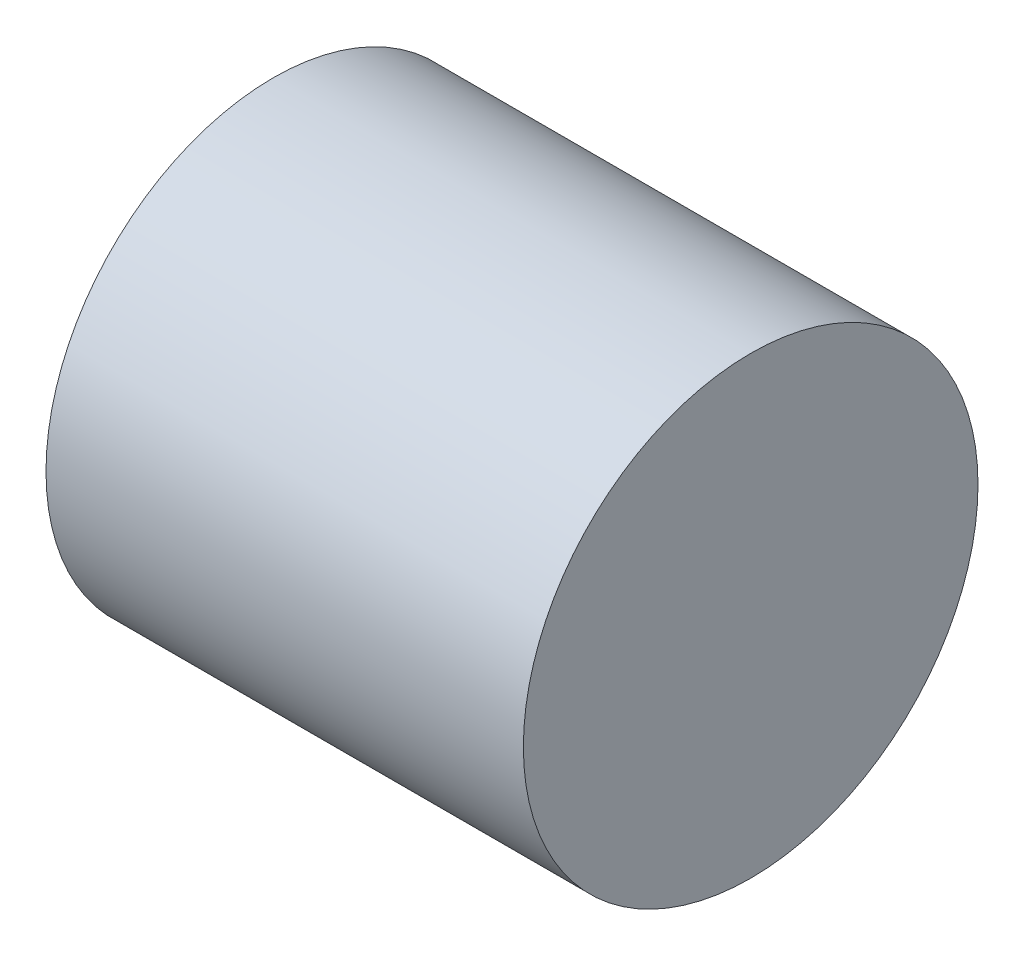
ISO-10303-21;
HEADER;
FILE_DESCRIPTION(('STEP AP214'),'2;1');
FILE_NAME('part.step','',(''),(''),'','','');
FILE_SCHEMA(('AUTOMOTIVE_DESIGN { 1 0 10303 214 1 1 1 1 }'));
ENDSEC;
DATA;
#1=APPLICATION_CONTEXT('core data for automotive mechanical design processes');
#2=APPLICATION_PROTOCOL_DEFINITION('international standard','automotive_design',2000,#1);
#3=PRODUCT_CONTEXT('',#1,'mechanical');
#4=PRODUCT('Part','Part','',(#3));
#5=PRODUCT_RELATED_PRODUCT_CATEGORY('part','',(#4));
#6=PRODUCT_DEFINITION_FORMATION('','',#4);
#7=PRODUCT_DEFINITION_CONTEXT('part definition',#1,'design');
#8=PRODUCT_DEFINITION('design','',#6,#7);
#9=PRODUCT_DEFINITION_SHAPE('','',#8);
#10=(LENGTH_UNIT() NAMED_UNIT(*) SI_UNIT(.MILLI.,.METRE.));
#11=(NAMED_UNIT(*) PLANE_ANGLE_UNIT() SI_UNIT($,.RADIAN.));
#12=(NAMED_UNIT(*) SI_UNIT($,.STERADIAN.) SOLID_ANGLE_UNIT());
#13=UNCERTAINTY_MEASURE_WITH_UNIT(LENGTH_MEASURE(1.E-05),#10,'distance_accuracy_value','');
#14=(GEOMETRIC_REPRESENTATION_CONTEXT(3) GLOBAL_UNCERTAINTY_ASSIGNED_CONTEXT((#13)) GLOBAL_UNIT_ASSIGNED_CONTEXT((#10,
#11,#12)) REPRESENTATION_CONTEXT('',''));
#15=CARTESIAN_POINT('',(0.,0.,0.));
#16=DIRECTION('',(0.,0.,1.));
#17=DIRECTION('',(1.,0.,0.));
#18=AXIS2_PLACEMENT_3D('',#15,#16,#17);
#19=CARTESIAN_POINT('',(16.8,0.,0.));
#20=DIRECTION('',(-1.,0.,0.));
#21=DIRECTION('',(0.,0.,1.));
#22=AXIS2_PLACEMENT_3D('',#19,#20,#21);
#23=CYLINDRICAL_SURFACE('',#22,8.);
#24=CARTESIAN_POINT('',(16.8,0.,0.));
#25=DIRECTION('',(1.,0.,0.));
#26=DIRECTION('',(0.,0.,-1.));
#27=AXIS2_PLACEMENT_3D('',#24,#25,#26);
#28=CIRCLE('',#27,8.);
#29=CARTESIAN_POINT('',(16.8,0.,-8.));
#30=VERTEX_POINT('',#29);
#31=EDGE_CURVE('E10',#30,#30,#28,.T.);
#32=ORIENTED_EDGE('',*,*,#31,.F.);
#33=EDGE_LOOP('',(#32));
#34=FACE_BOUND('',#33,.T.);
#35=CARTESIAN_POINT('',(0.,0.,0.));
#36=DIRECTION('',(1.,0.,0.));
#37=DIRECTION('',(0.,0.,-1.));
#38=AXIS2_PLACEMENT_3D('',#35,#36,#37);
#39=CIRCLE('',#38,8.);
#40=CARTESIAN_POINT('',(0.,0.,-8.));
#41=VERTEX_POINT('',#40);
#42=EDGE_CURVE('E34',#41,#41,#39,.T.);
#43=ORIENTED_EDGE('',*,*,#42,.T.);
#44=EDGE_LOOP('',(#43));
#45=FACE_BOUND('',#44,.T.);
#46=ADVANCED_FACE('F31',(#34,#45),#23,.T.);
#47=CARTESIAN_POINT('',(16.8,0.,0.));
#48=DIRECTION('',(1.,0.,0.));
#49=DIRECTION('',(0.,0.,-1.));
#50=AXIS2_PLACEMENT_3D('',#47,#48,#49);
#51=PLANE('',#50);
#52=ORIENTED_EDGE('',*,*,#31,.T.);
#53=EDGE_LOOP('',(#52));
#54=FACE_BOUND('',#53,.T.);
#55=ADVANCED_FACE('F46',(#54),#51,.T.);
#56=CARTESIAN_POINT('',(0.,0.,0.));
#57=DIRECTION('',(1.,0.,0.));
#58=DIRECTION('',(0.,0.,-1.));
#59=AXIS2_PLACEMENT_3D('',#56,#57,#58);
#60=PLANE('',#59);
#61=ORIENTED_EDGE('',*,*,#42,.F.);
#62=EDGE_LOOP('',(#61));
#63=FACE_BOUND('',#62,.T.);
#64=ADVANCED_FACE('F44',(#63),#60,.F.);
#65=CLOSED_SHELL('',(#46,#55,#64));
#66=MANIFOLD_SOLID_BREP('B2',#65);
#67=ADVANCED_BREP_SHAPE_REPRESENTATION('',(#18,#66),#14);
#68=SHAPE_DEFINITION_REPRESENTATION(#9,#67);
ENDSEC;
END-ISO-10303-21;
